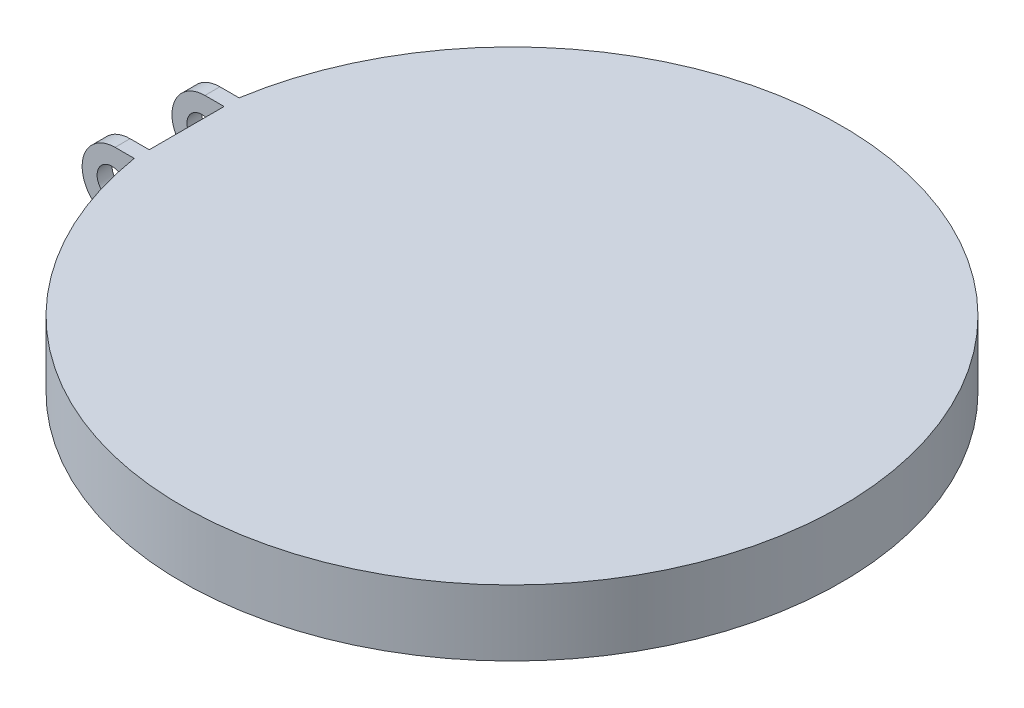
ISO-10303-21;
HEADER;
FILE_DESCRIPTION(('STEP AP214'),'2;1');
FILE_NAME('part.step','',(''),(''),'','','');
FILE_SCHEMA(('AUTOMOTIVE_DESIGN { 1 0 10303 214 1 1 1 1 }'));
ENDSEC;
DATA;
#1=APPLICATION_CONTEXT('core data for automotive mechanical design processes');
#2=APPLICATION_PROTOCOL_DEFINITION('international standard','automotive_design',2000,#1);
#3=PRODUCT_CONTEXT('',#1,'mechanical');
#4=PRODUCT('Part','Part','',(#3));
#5=PRODUCT_RELATED_PRODUCT_CATEGORY('part','',(#4));
#6=PRODUCT_DEFINITION_FORMATION('','',#4);
#7=PRODUCT_DEFINITION_CONTEXT('part definition',#1,'design');
#8=PRODUCT_DEFINITION('design','',#6,#7);
#9=PRODUCT_DEFINITION_SHAPE('','',#8);
#10=(LENGTH_UNIT() NAMED_UNIT(*) SI_UNIT(.MILLI.,.METRE.));
#11=(NAMED_UNIT(*) PLANE_ANGLE_UNIT() SI_UNIT($,.RADIAN.));
#12=(NAMED_UNIT(*) SI_UNIT($,.STERADIAN.) SOLID_ANGLE_UNIT());
#13=UNCERTAINTY_MEASURE_WITH_UNIT(LENGTH_MEASURE(1.E-05),#10,'distance_accuracy_value','');
#14=(GEOMETRIC_REPRESENTATION_CONTEXT(3) GLOBAL_UNCERTAINTY_ASSIGNED_CONTEXT((#13)) GLOBAL_UNIT_ASSIGNED_CONTEXT((#10,
#11,#12)) REPRESENTATION_CONTEXT('',''));
#15=CARTESIAN_POINT('',(0.,0.,0.));
#16=DIRECTION('',(0.,0.,1.));
#17=DIRECTION('',(1.,0.,0.));
#18=AXIS2_PLACEMENT_3D('',#15,#16,#17);
#19=CARTESIAN_POINT('',(-29.21,2.79399999999991,4.445));
#20=DIRECTION('',(0.,0.,-1.));
#21=DIRECTION('',(-1.,0.,0.));
#22=AXIS2_PLACEMENT_3D('',#19,#20,#21);
#23=CYLINDRICAL_SURFACE('',#22,2.79399999999992);
#24=DIRECTION('',(0.,0.,-1.));
#25=VECTOR('',#24,1.);
#26=CARTESIAN_POINT('',(-29.21,5.58799999999983,4.445));
#27=LINE('',#26,#25);
#28=CARTESIAN_POINT('',(-29.21,5.58799999999983,4.445));
#29=VERTEX_POINT('',#28);
#30=CARTESIAN_POINT('',(-29.21,5.58799999999985,3.175));
#31=VERTEX_POINT('',#30);
#32=EDGE_CURVE('E184',#29,#31,#27,.T.);
#33=ORIENTED_EDGE('',*,*,#32,.T.);
#34=CARTESIAN_POINT('',(-29.21,2.79399999999991,3.175));
#35=DIRECTION('',(0.,0.,1.));
#36=DIRECTION('',(1.,0.,0.));
#37=AXIS2_PLACEMENT_3D('',#34,#35,#36);
#38=CIRCLE('',#37,2.79399999999992);
#39=CARTESIAN_POINT('',(-29.21,-1.89084858881472E-13,3.175));
#40=VERTEX_POINT('',#39);
#41=EDGE_CURVE('E151',#31,#40,#38,.T.);
#42=ORIENTED_EDGE('',*,*,#41,.T.);
#43=DIRECTION('',(0.,0.,-1.));
#44=VECTOR('',#43,1.);
#45=CARTESIAN_POINT('',(-29.21,0.,4.445));
#46=LINE('',#45,#44);
#47=CARTESIAN_POINT('',(-29.21,0.,4.445));
#48=VERTEX_POINT('',#47);
#49=EDGE_CURVE('E189',#48,#40,#46,.T.);
#50=ORIENTED_EDGE('',*,*,#49,.F.);
#51=CARTESIAN_POINT('',(-29.21,2.79399999999991,4.445));
#52=DIRECTION('',(0.,0.,1.));
#53=DIRECTION('',(1.,0.,0.));
#54=AXIS2_PLACEMENT_3D('',#51,#52,#53);
#55=CIRCLE('',#54,2.79399999999992);
#56=EDGE_CURVE('E163',#29,#48,#55,.T.);
#57=ORIENTED_EDGE('',*,*,#56,.F.);
#58=EDGE_LOOP('',(#33,#42,#50,#57));
#59=FACE_BOUND('',#58,.T.);
#60=ADVANCED_FACE('F41',(#59),#23,.T.);
#61=CARTESIAN_POINT('',(-29.464,2.79399999999991,4.445));
#62=DIRECTION('',(0.,0.,-1.));
#63=DIRECTION('',(-1.,0.,0.));
#64=AXIS2_PLACEMENT_3D('',#61,#62,#63);
#65=CYLINDRICAL_SURFACE('',#64,1.27);
#66=CARTESIAN_POINT('',(-29.464,2.79399999999991,3.175));
#67=DIRECTION('',(0.,0.,1.));
#68=DIRECTION('',(1.,0.,0.));
#69=AXIS2_PLACEMENT_3D('',#66,#67,#68);
#70=CIRCLE('',#69,1.27);
#71=CARTESIAN_POINT('',(-28.194,2.79399999999991,3.175));
#72=VERTEX_POINT('',#71);
#73=EDGE_CURVE('E45',#72,#72,#70,.T.);
#74=ORIENTED_EDGE('',*,*,#73,.F.);
#75=EDGE_LOOP('',(#74));
#76=FACE_BOUND('',#75,.T.);
#77=CARTESIAN_POINT('',(-29.464,2.79399999999991,4.445));
#78=DIRECTION('',(0.,0.,1.));
#79=DIRECTION('',(1.,0.,0.));
#80=AXIS2_PLACEMENT_3D('',#77,#78,#79);
#81=CIRCLE('',#80,1.27);
#82=CARTESIAN_POINT('',(-28.194,2.79399999999991,4.445));
#83=VERTEX_POINT('',#82);
#84=EDGE_CURVE('E155',#83,#83,#81,.T.);
#85=ORIENTED_EDGE('',*,*,#84,.T.);
#86=EDGE_LOOP('',(#85));
#87=FACE_BOUND('',#86,.T.);
#88=ADVANCED_FACE('F227',(#76,#87),#65,.F.);
#89=CARTESIAN_POINT('',(23.368,0.,0.));
#90=DIRECTION('',(0.,-1.,0.));
#91=DIRECTION('',(1.,0.,0.));
#92=AXIS2_PLACEMENT_3D('',#89,#90,#91);
#93=PLANE('',#92);
#94=CARTESIAN_POINT('',(0.,-1.11022302462516E-13,0.));
#95=DIRECTION('',(0.,-1.,0.));
#96=DIRECTION('',(1.,0.,0.));
#97=AXIS2_PLACEMENT_3D('',#94,#95,#96);
#98=CIRCLE('',#97,23.368);
#99=CARTESIAN_POINT('',(23.368,0.,0.));
#100=VERTEX_POINT('',#99);
#101=EDGE_CURVE('E199',#100,#100,#98,.T.);
#102=ORIENTED_EDGE('',*,*,#101,.T.);
#103=EDGE_LOOP('',(#102));
#104=FACE_BOUND('',#103,.T.);
#105=ADVANCED_FACE('F43',(#104),#93,.T.);
#106=CARTESIAN_POINT('',(0.,5.58799999999995,0.));
#107=DIRECTION('',(0.,1.,0.));
#108=DIRECTION('',(-1.,0.,0.));
#109=AXIS2_PLACEMENT_3D('',#106,#107,#108);
#110=PLANE('',#109);
#111=DIRECTION('',(1.,0.,0.));
#112=VECTOR('',#111,1.);
#113=CARTESIAN_POINT('',(-32.0039999999999,5.58799999999984,3.175));
#114=LINE('',#113,#112);
#115=CARTESIAN_POINT('',(-27.5841544187963,5.58799999999986,3.175));
#116=VERTEX_POINT('',#115);
#117=EDGE_CURVE('E128',#31,#116,#114,.T.);
#118=ORIENTED_EDGE('',*,*,#117,.F.);
#119=ORIENTED_EDGE('',*,*,#32,.F.);
#120=DIRECTION('',(-1.,0.,0.));
#121=VECTOR('',#120,1.);
#122=CARTESIAN_POINT('',(-27.305,5.58799999999983,4.445));
#123=LINE('',#122,#121);
#124=CARTESIAN_POINT('',(-27.5841544187963,5.58799999999983,4.445));
#125=VERTEX_POINT('',#124);
#126=EDGE_CURVE('E172',#125,#29,#123,.T.);
#127=ORIENTED_EDGE('',*,*,#126,.F.);
#128=CARTESIAN_POINT('',(0.,5.58799999999993,0.));
#129=DIRECTION('',(0.,-1.,0.));
#130=DIRECTION('',(1.,0.,0.));
#131=AXIS2_PLACEMENT_3D('',#128,#129,#130);
#132=CIRCLE('',#131,27.94);
#133=CARTESIAN_POINT('',(-27.5841544187963,5.58799999999993,-4.445));
#134=VERTEX_POINT('',#133);
#135=EDGE_CURVE('E11',#134,#125,#132,.T.);
#136=ORIENTED_EDGE('',*,*,#135,.F.);
#137=DIRECTION('',(-1.,0.,0.));
#138=VECTOR('',#137,1.);
#139=CARTESIAN_POINT('',(-27.305,5.58799999999983,-4.445));
#140=LINE('',#139,#138);
#141=CARTESIAN_POINT('',(-29.21,5.58799999999983,-4.445));
#142=VERTEX_POINT('',#141);
#143=EDGE_CURVE('E168',#134,#142,#140,.T.);
#144=ORIENTED_EDGE('',*,*,#143,.T.);
#145=CARTESIAN_POINT('',(-29.21,5.58799999999985,-3.175));
#146=VERTEX_POINT('',#145);
#147=EDGE_CURVE('E132',#146,#142,#27,.T.);
#148=ORIENTED_EDGE('',*,*,#147,.F.);
#149=DIRECTION('',(-1.,0.,0.));
#150=VECTOR('',#149,1.);
#151=CARTESIAN_POINT('',(-27.5841544187963,5.58799999999986,-3.175));
#152=LINE('',#151,#150);
#153=CARTESIAN_POINT('',(-27.5841544187963,5.58799999999986,-3.175));
#154=VERTEX_POINT('',#153);
#155=EDGE_CURVE('E109',#154,#146,#152,.T.);
#156=ORIENTED_EDGE('',*,*,#155,.F.);
#157=DIRECTION('',(0.,0.,-1.));
#158=VECTOR('',#157,1.);
#159=CARTESIAN_POINT('',(-27.5841544187963,5.58799999999986,3.175));
#160=LINE('',#159,#158);
#161=EDGE_CURVE('E120',#116,#154,#160,.T.);
#162=ORIENTED_EDGE('',*,*,#161,.F.);
#163=EDGE_LOOP('',(#118,#119,#127,#136,#144,#148,#156,#162));
#164=FACE_BOUND('',#163,.T.);
#165=ADVANCED_FACE('F130',(#164),#110,.T.);
#166=CARTESIAN_POINT('',(3.43024899888577E-12,-1000.,0.));
#167=DIRECTION('',(0.,-1.,0.));
#168=DIRECTION('',(1.,0.,0.));
#169=AXIS2_PLACEMENT_3D('',#166,#167,#168);
#170=CYLINDRICAL_SURFACE('',#169,27.94);
#171=DIRECTION('',(0.,-1.,0.));
#172=VECTOR('',#171,1.);
#173=CARTESIAN_POINT('',(-27.5841544187929,-1000.,4.445));
#174=LINE('',#173,#172);
#175=CARTESIAN_POINT('',(-27.5841544187963,-2.05642820542702E-13,4.445));
#176=VERTEX_POINT('',#175);
#177=EDGE_CURVE('E196',#176,#125,#174,.F.);
#178=ORIENTED_EDGE('',*,*,#177,.F.);
#179=CARTESIAN_POINT('',(0.,-1.11022302462516E-13,0.));
#180=DIRECTION('',(0.,-1.,0.));
#181=DIRECTION('',(1.,0.,0.));
#182=AXIS2_PLACEMENT_3D('',#179,#180,#181);
#183=CIRCLE('',#182,27.94);
#184=CARTESIAN_POINT('',(-27.5841544187963,-2.05642820542702E-13,-4.445));
#185=VERTEX_POINT('',#184);
#186=EDGE_CURVE('E51',#185,#176,#183,.T.);
#187=ORIENTED_EDGE('',*,*,#186,.F.);
#188=DIRECTION('',(0.,-1.,0.));
#189=VECTOR('',#188,1.);
#190=CARTESIAN_POINT('',(-27.5841544187929,-1000.,-4.445));
#191=LINE('',#190,#189);
#192=EDGE_CURVE('E193',#185,#134,#191,.F.);
#193=ORIENTED_EDGE('',*,*,#192,.T.);
#194=ORIENTED_EDGE('',*,*,#135,.T.);
#195=EDGE_LOOP('',(#178,#187,#193,#194));
#196=FACE_BOUND('',#195,.T.);
#197=ADVANCED_FACE('F265',(#196),#170,.T.);
#198=CARTESIAN_POINT('',(27.94,0.,0.));
#199=DIRECTION('',(0.,-1.,0.));
#200=DIRECTION('',(1.,0.,0.));
#201=AXIS2_PLACEMENT_3D('',#198,#199,#200);
#202=PLANE('',#201);
#203=DIRECTION('',(1.,0.,0.));
#204=VECTOR('',#203,1.);
#205=CARTESIAN_POINT('',(-32.0039999999999,-1.98625837999344E-13,3.175));
#206=LINE('',#205,#204);
#207=CARTESIAN_POINT('',(-27.5841544187963,-1.83464667119191E-13,3.175));
#208=VERTEX_POINT('',#207);
#209=EDGE_CURVE('E127',#40,#208,#206,.T.);
#210=ORIENTED_EDGE('',*,*,#209,.T.);
#211=DIRECTION('',(0.,0.,-1.));
#212=VECTOR('',#211,1.);
#213=CARTESIAN_POINT('',(-27.5841544187963,-1.83880688453542E-13,3.175));
#214=LINE('',#213,#212);
#215=CARTESIAN_POINT('',(-27.5841544187963,-1.83880688453542E-13,-3.175));
#216=VERTEX_POINT('',#215);
#217=EDGE_CURVE('E116',#208,#216,#214,.T.);
#218=ORIENTED_EDGE('',*,*,#217,.T.);
#219=DIRECTION('',(-1.,0.,0.));
#220=VECTOR('',#219,1.);
#221=CARTESIAN_POINT('',(-27.5841544187963,-1.83880688453542E-13,-3.175));
#222=LINE('',#221,#220);
#223=CARTESIAN_POINT('',(-29.21,-1.89518539750466E-13,-3.175));
#224=VERTEX_POINT('',#223);
#225=EDGE_CURVE('E112',#216,#224,#222,.T.);
#226=ORIENTED_EDGE('',*,*,#225,.T.);
#227=CARTESIAN_POINT('',(-29.21,0.,-4.445));
#228=VERTEX_POINT('',#227);
#229=EDGE_CURVE('E188',#224,#228,#46,.T.);
#230=ORIENTED_EDGE('',*,*,#229,.T.);
#231=DIRECTION('',(1.,0.,0.));
#232=VECTOR('',#231,1.);
#233=CARTESIAN_POINT('',(-29.21,0.,-4.445));
#234=LINE('',#233,#232);
#235=EDGE_CURVE('E178',#228,#185,#234,.T.);
#236=ORIENTED_EDGE('',*,*,#235,.T.);
#237=ORIENTED_EDGE('',*,*,#186,.T.);
#238=DIRECTION('',(1.,0.,0.));
#239=VECTOR('',#238,1.);
#240=CARTESIAN_POINT('',(-29.21,0.,4.445));
#241=LINE('',#240,#239);
#242=EDGE_CURVE('E167',#48,#176,#241,.T.);
#243=ORIENTED_EDGE('',*,*,#242,.F.);
#244=ORIENTED_EDGE('',*,*,#49,.T.);
#245=EDGE_LOOP('',(#210,#218,#226,#230,#236,#237,#243,#244));
#246=FACE_BOUND('',#245,.T.);
#247=CARTESIAN_POINT('',(0.,-1.11022302462516E-13,0.));
#248=DIRECTION('',(0.,-1.,0.));
#249=DIRECTION('',(1.,0.,0.));
#250=AXIS2_PLACEMENT_3D('',#247,#248,#249);
#251=CIRCLE('',#250,24.638);
#252=CARTESIAN_POINT('',(24.638,0.,0.));
#253=VERTEX_POINT('',#252);
#254=EDGE_CURVE('E211',#253,#253,#251,.T.);
#255=ORIENTED_EDGE('',*,*,#254,.F.);
#256=EDGE_LOOP('',(#255));
#257=FACE_BOUND('',#256,.T.);
#258=ADVANCED_FACE('F261',(#246,#257),#202,.T.);
#259=CARTESIAN_POINT('',(3.43024899888577E-12,-1000.,0.));
#260=DIRECTION('',(0.,-1.,0.));
#261=DIRECTION('',(1.,0.,0.));
#262=AXIS2_PLACEMENT_3D('',#259,#260,#261);
#263=CYLINDRICAL_SURFACE('',#262,24.638);
#264=ORIENTED_EDGE('',*,*,#254,.T.);
#265=EDGE_LOOP('',(#264));
#266=FACE_BOUND('',#265,.T.);
#267=CARTESIAN_POINT('',(0.,-1.2700000000001,0.));
#268=DIRECTION('',(0.,-1.,0.));
#269=DIRECTION('',(1.,0.,0.));
#270=AXIS2_PLACEMENT_3D('',#267,#268,#269);
#271=CIRCLE('',#270,24.638);
#272=CARTESIAN_POINT('',(24.638,-1.27000000000002,0.));
#273=VERTEX_POINT('',#272);
#274=EDGE_CURVE('E207',#273,#273,#271,.T.);
#275=ORIENTED_EDGE('',*,*,#274,.F.);
#276=EDGE_LOOP('',(#275));
#277=FACE_BOUND('',#276,.T.);
#278=ADVANCED_FACE('F257',(#266,#277),#263,.T.);
#279=CARTESIAN_POINT('',(24.638,-1.26999999999999,0.));
#280=DIRECTION('',(0.,-1.,0.));
#281=DIRECTION('',(1.,0.,0.));
#282=AXIS2_PLACEMENT_3D('',#279,#280,#281);
#283=PLANE('',#282);
#284=ORIENTED_EDGE('',*,*,#274,.T.);
#285=EDGE_LOOP('',(#284));
#286=FACE_BOUND('',#285,.T.);
#287=CARTESIAN_POINT('',(0.,-1.2700000000001,0.));
#288=DIRECTION('',(0.,-1.,0.));
#289=DIRECTION('',(1.,0.,0.));
#290=AXIS2_PLACEMENT_3D('',#287,#288,#289);
#291=CIRCLE('',#290,23.368);
#292=CARTESIAN_POINT('',(23.368,-1.27000000000002,0.));
#293=VERTEX_POINT('',#292);
#294=EDGE_CURVE('E203',#293,#293,#291,.T.);
#295=ORIENTED_EDGE('',*,*,#294,.F.);
#296=EDGE_LOOP('',(#295));
#297=FACE_BOUND('',#296,.T.);
#298=ADVANCED_FACE('F253',(#286,#297),#283,.T.);
#299=CARTESIAN_POINT('',(3.43024899888577E-12,-1000.,0.));
#300=DIRECTION('',(0.,-1.,0.));
#301=DIRECTION('',(1.,0.,0.));
#302=AXIS2_PLACEMENT_3D('',#299,#300,#301);
#303=CYLINDRICAL_SURFACE('',#302,23.368);
#304=ORIENTED_EDGE('',*,*,#294,.T.);
#305=EDGE_LOOP('',(#304));
#306=FACE_BOUND('',#305,.T.);
#307=ORIENTED_EDGE('',*,*,#101,.F.);
#308=EDGE_LOOP('',(#307));
#309=FACE_BOUND('',#308,.T.);
#310=ADVANCED_FACE('F241',(#306,#309),#303,.F.);
#311=CARTESIAN_POINT('',(-29.21,2.79399999999991,4.445));
#312=DIRECTION('',(0.,0.,1.));
#313=DIRECTION('',(1.,0.,0.));
#314=AXIS2_PLACEMENT_3D('',#311,#312,#313);
#315=PLANE('',#314);
#316=ORIENTED_EDGE('',*,*,#242,.T.);
#317=ORIENTED_EDGE('',*,*,#177,.T.);
#318=ORIENTED_EDGE('',*,*,#126,.T.);
#319=ORIENTED_EDGE('',*,*,#56,.T.);
#320=EDGE_LOOP('',(#316,#317,#318,#319));
#321=FACE_BOUND('',#320,.T.);
#322=ORIENTED_EDGE('',*,*,#84,.F.);
#323=EDGE_LOOP('',(#322));
#324=FACE_BOUND('',#323,.T.);
#325=ADVANCED_FACE('F232',(#321,#324),#315,.T.);
#326=CARTESIAN_POINT('',(-29.21,2.79399999999991,-4.445));
#327=DIRECTION('',(0.,0.,1.));
#328=DIRECTION('',(1.,0.,0.));
#329=AXIS2_PLACEMENT_3D('',#326,#327,#328);
#330=PLANE('',#329);
#331=ORIENTED_EDGE('',*,*,#192,.F.);
#332=ORIENTED_EDGE('',*,*,#235,.F.);
#333=CARTESIAN_POINT('',(-29.21,2.79399999999991,-4.445));
#334=DIRECTION('',(0.,0.,1.));
#335=DIRECTION('',(1.,0.,0.));
#336=AXIS2_PLACEMENT_3D('',#333,#334,#335);
#337=CIRCLE('',#336,2.79399999999992);
#338=EDGE_CURVE('E159',#142,#228,#337,.T.);
#339=ORIENTED_EDGE('',*,*,#338,.F.);
#340=ORIENTED_EDGE('',*,*,#143,.F.);
#341=EDGE_LOOP('',(#331,#332,#339,#340));
#342=FACE_BOUND('',#341,.T.);
#343=CARTESIAN_POINT('',(-29.464,2.79399999999991,-4.445));
#344=DIRECTION('',(0.,0.,1.));
#345=DIRECTION('',(1.,0.,0.));
#346=AXIS2_PLACEMENT_3D('',#343,#344,#345);
#347=CIRCLE('',#346,1.27);
#348=CARTESIAN_POINT('',(-28.194,2.79399999999991,-4.445));
#349=VERTEX_POINT('',#348);
#350=EDGE_CURVE('E154',#349,#349,#347,.T.);
#351=ORIENTED_EDGE('',*,*,#350,.T.);
#352=EDGE_LOOP('',(#351));
#353=FACE_BOUND('',#352,.T.);
#354=ADVANCED_FACE('F230',(#342,#353),#330,.F.);
#355=CARTESIAN_POINT('',(-29.21,2.79399999999991,-3.175));
#356=DIRECTION('',(0.,0.,-1.));
#357=DIRECTION('',(-1.,0.,0.));
#358=AXIS2_PLACEMENT_3D('',#355,#356,#357);
#359=CIRCLE('',#358,2.79399999999992);
#360=EDGE_CURVE('E148',#224,#146,#359,.T.);
#361=ORIENTED_EDGE('',*,*,#360,.T.);
#362=ORIENTED_EDGE('',*,*,#147,.T.);
#363=ORIENTED_EDGE('',*,*,#338,.T.);
#364=ORIENTED_EDGE('',*,*,#229,.F.);
#365=EDGE_LOOP('',(#361,#362,#363,#364));
#366=FACE_BOUND('',#365,.T.);
#367=ADVANCED_FACE('F225',(#366),#23,.T.);
#368=CARTESIAN_POINT('',(-29.464,2.79399999999991,-3.175));
#369=DIRECTION('',(0.,0.,-1.));
#370=DIRECTION('',(-1.,0.,0.));
#371=AXIS2_PLACEMENT_3D('',#368,#369,#370);
#372=CIRCLE('',#371,1.27);
#373=CARTESIAN_POINT('',(-30.734,2.79399999999991,-3.175));
#374=VERTEX_POINT('',#373);
#375=EDGE_CURVE('E140',#374,#374,#372,.T.);
#376=ORIENTED_EDGE('',*,*,#375,.F.);
#377=EDGE_LOOP('',(#376));
#378=FACE_BOUND('',#377,.T.);
#379=ORIENTED_EDGE('',*,*,#350,.F.);
#380=EDGE_LOOP('',(#379));
#381=FACE_BOUND('',#380,.T.);
#382=ADVANCED_FACE('F221',(#378,#381),#65,.F.);
#383=CARTESIAN_POINT('',(-32.0039999999999,-7.73676514841235,3.175));
#384=DIRECTION('',(0.,0.,1.));
#385=DIRECTION('',(1.,0.,0.));
#386=AXIS2_PLACEMENT_3D('',#383,#384,#385);
#387=PLANE('',#386);
#388=ORIENTED_EDGE('',*,*,#73,.T.);
#389=EDGE_LOOP('',(#388));
#390=FACE_BOUND('',#389,.T.);
#391=ORIENTED_EDGE('',*,*,#117,.T.);
#392=DIRECTION('',(0.,1.,0.));
#393=VECTOR('',#392,1.);
#394=CARTESIAN_POINT('',(-27.5841544187963,-7.73676514841233,3.175));
#395=LINE('',#394,#393);
#396=EDGE_CURVE('E123',#208,#116,#395,.T.);
#397=ORIENTED_EDGE('',*,*,#396,.F.);
#398=ORIENTED_EDGE('',*,*,#209,.F.);
#399=ORIENTED_EDGE('',*,*,#41,.F.);
#400=EDGE_LOOP('',(#391,#397,#398,#399));
#401=FACE_BOUND('',#400,.T.);
#402=ADVANCED_FACE('F224',(#390,#401),#387,.F.);
#403=CARTESIAN_POINT('',(-27.5841544187963,-7.73676514841233,-3.175));
#404=DIRECTION('',(0.,0.,-1.));
#405=DIRECTION('',(-1.,0.,0.));
#406=AXIS2_PLACEMENT_3D('',#403,#404,#405);
#407=PLANE('',#406);
#408=ORIENTED_EDGE('',*,*,#375,.T.);
#409=EDGE_LOOP('',(#408));
#410=FACE_BOUND('',#409,.T.);
#411=ORIENTED_EDGE('',*,*,#360,.F.);
#412=ORIENTED_EDGE('',*,*,#225,.F.);
#413=DIRECTION('',(0.,1.,0.));
#414=VECTOR('',#413,1.);
#415=CARTESIAN_POINT('',(-27.5841544187963,-7.73676514841233,-3.175));
#416=LINE('',#415,#414);
#417=EDGE_CURVE('E105',#216,#154,#416,.T.);
#418=ORIENTED_EDGE('',*,*,#417,.T.);
#419=ORIENTED_EDGE('',*,*,#155,.T.);
#420=EDGE_LOOP('',(#411,#412,#418,#419));
#421=FACE_BOUND('',#420,.T.);
#422=ADVANCED_FACE('F107',(#410,#421),#407,.F.);
#423=CARTESIAN_POINT('',(-27.5841544187963,-7.73676514841233,3.175));
#424=DIRECTION('',(1.,0.,0.));
#425=DIRECTION('',(0.,1.,0.));
#426=AXIS2_PLACEMENT_3D('',#423,#424,#425);
#427=PLANE('',#426);
#428=ORIENTED_EDGE('',*,*,#396,.T.);
#429=ORIENTED_EDGE('',*,*,#161,.T.);
#430=ORIENTED_EDGE('',*,*,#417,.F.);
#431=ORIENTED_EDGE('',*,*,#217,.F.);
#432=EDGE_LOOP('',(#428,#429,#430,#431));
#433=FACE_BOUND('',#432,.T.);
#434=ADVANCED_FACE('F121',(#433),#427,.F.);
#435=CLOSED_SHELL('',(#60,#88,#105,#165,#197,#258,#278,#298,#310,#325,#354,#367,#382,#402,#422,#434));
#436=MANIFOLD_SOLID_BREP('B2',#435);
#437=ADVANCED_BREP_SHAPE_REPRESENTATION('',(#18,#436),#14);
#438=SHAPE_DEFINITION_REPRESENTATION(#9,#437);
ENDSEC;
END-ISO-10303-21;
